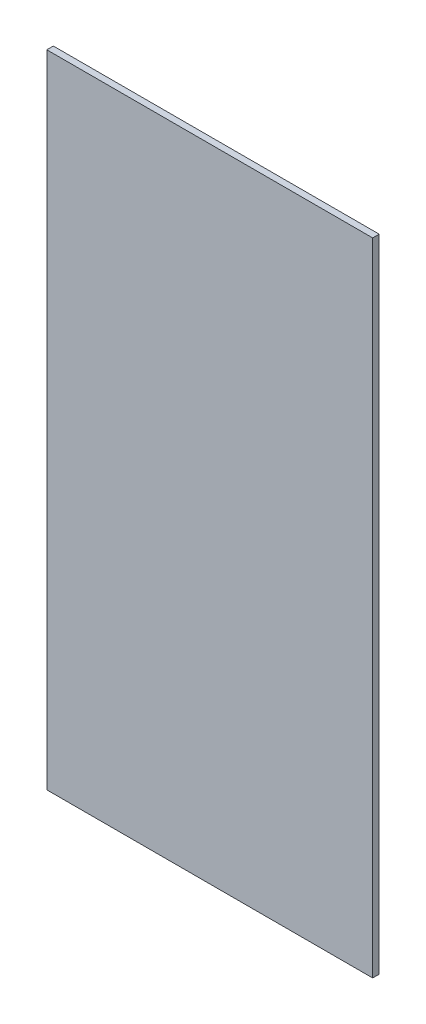
ISO-10303-21;
HEADER;
FILE_DESCRIPTION(('STEP AP214'),'2;1');
FILE_NAME('part.step','',(''),(''),'','','');
FILE_SCHEMA(('AUTOMOTIVE_DESIGN { 1 0 10303 214 1 1 1 1 }'));
ENDSEC;
DATA;
#1=APPLICATION_CONTEXT('core data for automotive mechanical design processes');
#2=APPLICATION_PROTOCOL_DEFINITION('international standard','automotive_design',2000,#1);
#3=PRODUCT_CONTEXT('',#1,'mechanical');
#4=PRODUCT('Part','Part','',(#3));
#5=PRODUCT_RELATED_PRODUCT_CATEGORY('part','',(#4));
#6=PRODUCT_DEFINITION_FORMATION('','',#4);
#7=PRODUCT_DEFINITION_CONTEXT('part definition',#1,'design');
#8=PRODUCT_DEFINITION('design','',#6,#7);
#9=PRODUCT_DEFINITION_SHAPE('','',#8);
#10=(LENGTH_UNIT() NAMED_UNIT(*) SI_UNIT(.MILLI.,.METRE.));
#11=(NAMED_UNIT(*) PLANE_ANGLE_UNIT() SI_UNIT($,.RADIAN.));
#12=(NAMED_UNIT(*) SI_UNIT($,.STERADIAN.) SOLID_ANGLE_UNIT());
#13=UNCERTAINTY_MEASURE_WITH_UNIT(LENGTH_MEASURE(1.E-05),#10,'distance_accuracy_value','');
#14=(GEOMETRIC_REPRESENTATION_CONTEXT(3) GLOBAL_UNCERTAINTY_ASSIGNED_CONTEXT((#13)) GLOBAL_UNIT_ASSIGNED_CONTEXT((#10,
#11,#12)) REPRESENTATION_CONTEXT('',''));
#15=CARTESIAN_POINT('',(0.,0.,0.));
#16=DIRECTION('',(0.,0.,1.));
#17=DIRECTION('',(1.,0.,0.));
#18=AXIS2_PLACEMENT_3D('',#15,#16,#17);
#19=CARTESIAN_POINT('',(-75.,-147.5,3.));
#20=DIRECTION('',(1.,0.,0.));
#21=DIRECTION('',(0.,0.,-1.));
#22=AXIS2_PLACEMENT_3D('',#19,#20,#21);
#23=PLANE('',#22);
#24=DIRECTION('',(0.,-1.,0.));
#25=VECTOR('',#24,1.);
#26=CARTESIAN_POINT('',(-75.,-147.5,0.));
#27=LINE('',#26,#25);
#28=CARTESIAN_POINT('',(-75.,147.5,0.));
#29=VERTEX_POINT('',#28);
#30=CARTESIAN_POINT('',(-75.,-147.5,0.));
#31=VERTEX_POINT('',#30);
#32=EDGE_CURVE('E107',#29,#31,#27,.T.);
#33=ORIENTED_EDGE('',*,*,#32,.T.);
#34=DIRECTION('',(0.,0.,-1.));
#35=VECTOR('',#34,1.);
#36=CARTESIAN_POINT('',(-75.,-147.5,3.));
#37=LINE('',#36,#35);
#38=CARTESIAN_POINT('',(-75.,-147.5,3.));
#39=VERTEX_POINT('',#38);
#40=EDGE_CURVE('E11',#39,#31,#37,.T.);
#41=ORIENTED_EDGE('',*,*,#40,.F.);
#42=DIRECTION('',(0.,-1.,0.));
#43=VECTOR('',#42,1.);
#44=CARTESIAN_POINT('',(-75.,-147.5,3.));
#45=LINE('',#44,#43);
#46=CARTESIAN_POINT('',(-75.,147.5,3.));
#47=VERTEX_POINT('',#46);
#48=EDGE_CURVE('E91',#47,#39,#45,.T.);
#49=ORIENTED_EDGE('',*,*,#48,.F.);
#50=DIRECTION('',(0.,0.,-1.));
#51=VECTOR('',#50,1.);
#52=CARTESIAN_POINT('',(-75.,147.5,3.));
#53=LINE('',#52,#51);
#54=EDGE_CURVE('E103',#47,#29,#53,.T.);
#55=ORIENTED_EDGE('',*,*,#54,.T.);
#56=EDGE_LOOP('',(#33,#41,#49,#55));
#57=FACE_BOUND('',#56,.T.);
#58=ADVANCED_FACE('F39',(#57),#23,.F.);
#59=CARTESIAN_POINT('',(-75.,-147.5,3.));
#60=DIRECTION('',(0.,1.,0.));
#61=DIRECTION('',(0.,0.,1.));
#62=AXIS2_PLACEMENT_3D('',#59,#60,#61);
#63=PLANE('',#62);
#64=DIRECTION('',(1.,0.,0.));
#65=VECTOR('',#64,1.);
#66=CARTESIAN_POINT('',(-75.,-147.5,0.));
#67=LINE('',#66,#65);
#68=CARTESIAN_POINT('',(75.,-147.5,0.));
#69=VERTEX_POINT('',#68);
#70=EDGE_CURVE('E96',#31,#69,#67,.T.);
#71=ORIENTED_EDGE('',*,*,#70,.T.);
#72=DIRECTION('',(0.,0.,-1.));
#73=VECTOR('',#72,1.);
#74=CARTESIAN_POINT('',(75.,-147.5,3.));
#75=LINE('',#74,#73);
#76=CARTESIAN_POINT('',(75.,-147.5,3.));
#77=VERTEX_POINT('',#76);
#78=EDGE_CURVE('E48',#77,#69,#75,.T.);
#79=ORIENTED_EDGE('',*,*,#78,.F.);
#80=DIRECTION('',(1.,0.,0.));
#81=VECTOR('',#80,1.);
#82=CARTESIAN_POINT('',(-75.,-147.5,3.));
#83=LINE('',#82,#81);
#84=EDGE_CURVE('E86',#39,#77,#83,.T.);
#85=ORIENTED_EDGE('',*,*,#84,.F.);
#86=ORIENTED_EDGE('',*,*,#40,.T.);
#87=EDGE_LOOP('',(#71,#79,#85,#86));
#88=FACE_BOUND('',#87,.T.);
#89=ADVANCED_FACE('F95',(#88),#63,.F.);
#90=CARTESIAN_POINT('',(75.,-147.5,3.));
#91=DIRECTION('',(-1.,0.,0.));
#92=DIRECTION('',(0.,0.,1.));
#93=AXIS2_PLACEMENT_3D('',#90,#91,#92);
#94=PLANE('',#93);
#95=DIRECTION('',(0.,1.,0.));
#96=VECTOR('',#95,1.);
#97=CARTESIAN_POINT('',(75.,-147.5,0.));
#98=LINE('',#97,#96);
#99=CARTESIAN_POINT('',(75.,147.5,0.));
#100=VERTEX_POINT('',#99);
#101=EDGE_CURVE('E73',#69,#100,#98,.T.);
#102=ORIENTED_EDGE('',*,*,#101,.T.);
#103=DIRECTION('',(0.,0.,-1.));
#104=VECTOR('',#103,1.);
#105=CARTESIAN_POINT('',(75.,147.5,3.));
#106=LINE('',#105,#104);
#107=CARTESIAN_POINT('',(75.,147.5,3.));
#108=VERTEX_POINT('',#107);
#109=EDGE_CURVE('E98',#108,#100,#106,.T.);
#110=ORIENTED_EDGE('',*,*,#109,.F.);
#111=DIRECTION('',(0.,1.,0.));
#112=VECTOR('',#111,1.);
#113=CARTESIAN_POINT('',(75.,-147.5,3.));
#114=LINE('',#113,#112);
#115=EDGE_CURVE('E89',#77,#108,#114,.T.);
#116=ORIENTED_EDGE('',*,*,#115,.F.);
#117=ORIENTED_EDGE('',*,*,#78,.T.);
#118=EDGE_LOOP('',(#102,#110,#116,#117));
#119=FACE_BOUND('',#118,.T.);
#120=ADVANCED_FACE('F99',(#119),#94,.F.);
#121=CARTESIAN_POINT('',(-75.,147.5,3.));
#122=DIRECTION('',(0.,-1.,0.));
#123=DIRECTION('',(0.,0.,-1.));
#124=AXIS2_PLACEMENT_3D('',#121,#122,#123);
#125=PLANE('',#124);
#126=DIRECTION('',(-1.,0.,0.));
#127=VECTOR('',#126,1.);
#128=CARTESIAN_POINT('',(-75.,147.5,0.));
#129=LINE('',#128,#127);
#130=EDGE_CURVE('E79',#100,#29,#129,.T.);
#131=ORIENTED_EDGE('',*,*,#130,.T.);
#132=ORIENTED_EDGE('',*,*,#54,.F.);
#133=DIRECTION('',(-1.,0.,0.));
#134=VECTOR('',#133,1.);
#135=CARTESIAN_POINT('',(-75.,147.5,3.));
#136=LINE('',#135,#134);
#137=EDGE_CURVE('E56',#108,#47,#136,.T.);
#138=ORIENTED_EDGE('',*,*,#137,.F.);
#139=ORIENTED_EDGE('',*,*,#109,.T.);
#140=EDGE_LOOP('',(#131,#132,#138,#139));
#141=FACE_BOUND('',#140,.T.);
#142=ADVANCED_FACE('F120',(#141),#125,.F.);
#143=CARTESIAN_POINT('',(0.,0.,3.));
#144=DIRECTION('',(0.,0.,-1.));
#145=DIRECTION('',(-1.,0.,0.));
#146=AXIS2_PLACEMENT_3D('',#143,#144,#145);
#147=PLANE('',#146);
#148=ORIENTED_EDGE('',*,*,#48,.T.);
#149=ORIENTED_EDGE('',*,*,#84,.T.);
#150=ORIENTED_EDGE('',*,*,#115,.T.);
#151=ORIENTED_EDGE('',*,*,#137,.T.);
#152=EDGE_LOOP('',(#148,#149,#150,#151));
#153=FACE_BOUND('',#152,.T.);
#154=ADVANCED_FACE('F87',(#153),#147,.F.);
#155=CARTESIAN_POINT('',(0.,0.,0.));
#156=DIRECTION('',(0.,0.,-1.));
#157=DIRECTION('',(-1.,0.,0.));
#158=AXIS2_PLACEMENT_3D('',#155,#156,#157);
#159=PLANE('',#158);
#160=ORIENTED_EDGE('',*,*,#32,.F.);
#161=ORIENTED_EDGE('',*,*,#130,.F.);
#162=ORIENTED_EDGE('',*,*,#101,.F.);
#163=ORIENTED_EDGE('',*,*,#70,.F.);
#164=EDGE_LOOP('',(#160,#161,#162,#163));
#165=FACE_BOUND('',#164,.T.);
#166=ADVANCED_FACE('F123',(#165),#159,.T.);
#167=CLOSED_SHELL('',(#58,#89,#120,#142,#154,#166));
#168=MANIFOLD_SOLID_BREP('B2',#167);
#169=ADVANCED_BREP_SHAPE_REPRESENTATION('',(#18,#168),#14);
#170=SHAPE_DEFINITION_REPRESENTATION(#9,#169);
ENDSEC;
END-ISO-10303-21;
